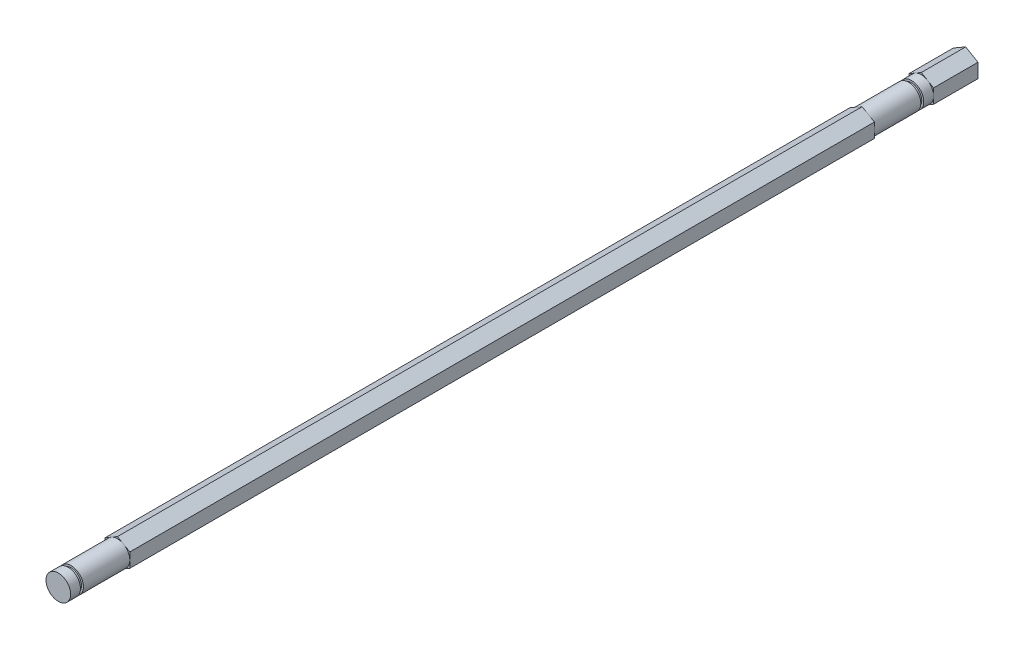
ISO-10303-21;
HEADER;
FILE_DESCRIPTION(('STEP AP214'),'2;1');
FILE_NAME('part.step','',(''),(''),'','','');
FILE_SCHEMA(('AUTOMOTIVE_DESIGN { 1 0 10303 214 1 1 1 1 }'));
ENDSEC;
DATA;
#1=APPLICATION_CONTEXT('core data for automotive mechanical design processes');
#2=APPLICATION_PROTOCOL_DEFINITION('international standard','automotive_design',2000,#1);
#3=PRODUCT_CONTEXT('',#1,'mechanical');
#4=PRODUCT('Part','Part','',(#3));
#5=PRODUCT_RELATED_PRODUCT_CATEGORY('part','',(#4));
#6=PRODUCT_DEFINITION_FORMATION('','',#4);
#7=PRODUCT_DEFINITION_CONTEXT('part definition',#1,'design');
#8=PRODUCT_DEFINITION('design','',#6,#7);
#9=PRODUCT_DEFINITION_SHAPE('','',#8);
#10=(LENGTH_UNIT() NAMED_UNIT(*) SI_UNIT(.MILLI.,.METRE.));
#11=(NAMED_UNIT(*) PLANE_ANGLE_UNIT() SI_UNIT($,.RADIAN.));
#12=(NAMED_UNIT(*) SI_UNIT($,.STERADIAN.) SOLID_ANGLE_UNIT());
#13=UNCERTAINTY_MEASURE_WITH_UNIT(LENGTH_MEASURE(1.E-05),#10,'distance_accuracy_value','');
#14=(GEOMETRIC_REPRESENTATION_CONTEXT(3) GLOBAL_UNCERTAINTY_ASSIGNED_CONTEXT((#13)) GLOBAL_UNIT_ASSIGNED_CONTEXT((#10,
#11,#12)) REPRESENTATION_CONTEXT('',''));
#15=CARTESIAN_POINT('',(0.,0.,0.));
#16=DIRECTION('',(0.,0.,1.));
#17=DIRECTION('',(1.,0.,0.));
#18=AXIS2_PLACEMENT_3D('',#15,#16,#17);
#19=CARTESIAN_POINT('',(0.,0.,95.885));
#20=DIRECTION('',(0.,0.,1.));
#21=DIRECTION('',(1.,0.,0.));
#22=AXIS2_PLACEMENT_3D('',#19,#20,#21);
#23=CYLINDRICAL_SURFACE('',#22,3.17500000000001);
#24=CARTESIAN_POINT('',(0.,0.,95.885));
#25=DIRECTION('',(0.,0.,1.));
#26=DIRECTION('',(1.,0.,0.));
#27=AXIS2_PLACEMENT_3D('',#24,#25,#26);
#28=CIRCLE('',#27,3.17500000000001);
#29=CARTESIAN_POINT('',(3.175,0.,95.885));
#30=VERTEX_POINT('',#29);
#31=CARTESIAN_POINT('',(1.5875,2.7496306570156,95.885));
#32=VERTEX_POINT('',#31);
#33=EDGE_CURVE('E273',#30,#32,#28,.T.);
#34=ORIENTED_EDGE('',*,*,#33,.T.);
#35=CARTESIAN_POINT('',(-1.5875,2.7496306570156,95.885));
#36=VERTEX_POINT('',#35);
#37=EDGE_CURVE('E278',#32,#36,#28,.T.);
#38=ORIENTED_EDGE('',*,*,#37,.T.);
#39=CARTESIAN_POINT('',(-3.17500000000001,0.,95.885));
#40=VERTEX_POINT('',#39);
#41=EDGE_CURVE('E479',#36,#40,#28,.T.);
#42=ORIENTED_EDGE('',*,*,#41,.T.);
#43=CARTESIAN_POINT('',(-1.5875,-2.7496306570156,95.885));
#44=VERTEX_POINT('',#43);
#45=EDGE_CURVE('E487',#40,#44,#28,.T.);
#46=ORIENTED_EDGE('',*,*,#45,.T.);
#47=CARTESIAN_POINT('',(1.5875,-2.7496306570156,95.885));
#48=VERTEX_POINT('',#47);
#49=EDGE_CURVE('E490',#44,#48,#28,.T.);
#50=ORIENTED_EDGE('',*,*,#49,.T.);
#51=EDGE_CURVE('E279',#48,#30,#28,.T.);
#52=ORIENTED_EDGE('',*,*,#51,.T.);
#53=EDGE_LOOP('',(#34,#38,#42,#46,#50,#52));
#54=FACE_BOUND('',#53,.T.);
#55=CARTESIAN_POINT('',(0.,0.,107.823));
#56=DIRECTION('',(0.,0.,1.));
#57=DIRECTION('',(1.,0.,0.));
#58=AXIS2_PLACEMENT_3D('',#55,#56,#57);
#59=CIRCLE('',#58,3.17500000000001);
#60=CARTESIAN_POINT('',(3.17500000000001,0.,107.823));
#61=VERTEX_POINT('',#60);
#62=EDGE_CURVE('E236',#61,#61,#59,.F.);
#63=ORIENTED_EDGE('',*,*,#62,.T.);
#64=EDGE_LOOP('',(#63));
#65=FACE_BOUND('',#64,.T.);
#66=ADVANCED_FACE('F45',(#54,#65),#23,.T.);
#67=CARTESIAN_POINT('',(0.,0.,-95.885));
#68=DIRECTION('',(0.,0.,-1.));
#69=DIRECTION('',(-1.,0.,0.));
#70=AXIS2_PLACEMENT_3D('',#67,#68,#69);
#71=CYLINDRICAL_SURFACE('',#70,3.175);
#72=CARTESIAN_POINT('',(0.,0.,-95.885));
#73=DIRECTION('',(0.,0.,-1.));
#74=DIRECTION('',(-1.,0.,0.));
#75=AXIS2_PLACEMENT_3D('',#72,#73,#74);
#76=CIRCLE('',#75,3.175);
#77=CARTESIAN_POINT('',(-1.5875,2.74963065701559,-95.885));
#78=VERTEX_POINT('',#77);
#79=CARTESIAN_POINT('',(1.5875,2.74963065701559,-95.885));
#80=VERTEX_POINT('',#79);
#81=EDGE_CURVE('E252',#78,#80,#76,.T.);
#82=ORIENTED_EDGE('',*,*,#81,.T.);
#83=CARTESIAN_POINT('',(3.17499999999999,0.,-95.885));
#84=VERTEX_POINT('',#83);
#85=EDGE_CURVE('E71',#80,#84,#76,.T.);
#86=ORIENTED_EDGE('',*,*,#85,.T.);
#87=CARTESIAN_POINT('',(1.5875,-2.74963065701559,-95.885));
#88=VERTEX_POINT('',#87);
#89=EDGE_CURVE('E428',#84,#88,#76,.T.);
#90=ORIENTED_EDGE('',*,*,#89,.T.);
#91=CARTESIAN_POINT('',(-1.5875,-2.74963065701559,-95.885));
#92=VERTEX_POINT('',#91);
#93=EDGE_CURVE('E431',#88,#92,#76,.T.);
#94=ORIENTED_EDGE('',*,*,#93,.T.);
#95=CARTESIAN_POINT('',(-3.175,0.,-95.885));
#96=VERTEX_POINT('',#95);
#97=EDGE_CURVE('E253',#92,#96,#76,.T.);
#98=ORIENTED_EDGE('',*,*,#97,.T.);
#99=EDGE_CURVE('E247',#96,#78,#76,.T.);
#100=ORIENTED_EDGE('',*,*,#99,.T.);
#101=EDGE_LOOP('',(#82,#86,#90,#94,#98,#100));
#102=FACE_BOUND('',#101,.T.);
#103=CARTESIAN_POINT('',(0.,0.,-107.823));
#104=DIRECTION('',(0.,0.,-1.));
#105=DIRECTION('',(-1.,0.,0.));
#106=AXIS2_PLACEMENT_3D('',#103,#104,#105);
#107=CIRCLE('',#106,3.175);
#108=CARTESIAN_POINT('',(-3.175,0.,-107.823));
#109=VERTEX_POINT('',#108);
#110=EDGE_CURVE('E242',#109,#109,#107,.F.);
#111=ORIENTED_EDGE('',*,*,#110,.T.);
#112=EDGE_LOOP('',(#111));
#113=FACE_BOUND('',#112,.T.);
#114=ADVANCED_FACE('F375',(#102,#113),#71,.T.);
#115=CARTESIAN_POINT('',(3.17499999999998,1.83308710467708,111.125));
#116=DIRECTION('',(-0.5,-0.866025403784438,0.));
#117=DIRECTION('',(0.866025403784439,-0.5,0.));
#118=AXIS2_PLACEMENT_3D('',#115,#116,#117);
#119=PLANE('',#118);
#120=DIRECTION('',(0.866025403784439,-0.5,0.));
#121=VECTOR('',#120,1.);
#122=CARTESIAN_POINT('',(3.17499999999998,1.83308710467708,-95.885));
#123=LINE('',#122,#121);
#124=CARTESIAN_POINT('',(0.,3.66617420935413,-95.885));
#125=VERTEX_POINT('',#124);
#126=EDGE_CURVE('E260',#125,#80,#123,.T.);
#127=ORIENTED_EDGE('',*,*,#126,.F.);
#128=DIRECTION('',(0.,0.,-1.));
#129=VECTOR('',#128,1.);
#130=CARTESIAN_POINT('',(0.,3.66617420935413,111.125));
#131=LINE('',#130,#129);
#132=CARTESIAN_POINT('',(0.,3.66617420935413,95.885));
#133=VERTEX_POINT('',#132);
#134=EDGE_CURVE('E319',#133,#125,#131,.T.);
#135=ORIENTED_EDGE('',*,*,#134,.F.);
#136=DIRECTION('',(-0.866025403784439,0.5,0.));
#137=VECTOR('',#136,1.);
#138=CARTESIAN_POINT('',(3.17499999999998,1.83308710467708,95.885));
#139=LINE('',#138,#137);
#140=EDGE_CURVE('E295',#32,#133,#139,.T.);
#141=ORIENTED_EDGE('',*,*,#140,.F.);
#142=CARTESIAN_POINT('',(3.17499999999998,1.83308710467708,95.885));
#143=VERTEX_POINT('',#142);
#144=EDGE_CURVE('E298',#143,#32,#139,.T.);
#145=ORIENTED_EDGE('',*,*,#144,.F.);
#146=DIRECTION('',(0.,0.,-1.));
#147=VECTOR('',#146,1.);
#148=CARTESIAN_POINT('',(3.17499999999998,1.83308710467708,111.125));
#149=LINE('',#148,#147);
#150=CARTESIAN_POINT('',(3.17499999999998,1.83308710467708,-95.885));
#151=VERTEX_POINT('',#150);
#152=EDGE_CURVE('E299',#143,#151,#149,.T.);
#153=ORIENTED_EDGE('',*,*,#152,.T.);
#154=EDGE_CURVE('E256',#80,#151,#123,.T.);
#155=ORIENTED_EDGE('',*,*,#154,.F.);
#156=EDGE_LOOP('',(#127,#135,#141,#145,#153,#155));
#157=FACE_BOUND('',#156,.T.);
#158=ADVANCED_FACE('F47',(#157),#119,.F.);
#159=CARTESIAN_POINT('',(0.,3.66617420935413,111.125));
#160=DIRECTION('',(0.5,-0.866025403784439,0.));
#161=DIRECTION('',(0.866025403784439,0.5,0.));
#162=AXIS2_PLACEMENT_3D('',#159,#160,#161);
#163=PLANE('',#162);
#164=DIRECTION('',(0.866025403784439,0.5,0.));
#165=VECTOR('',#164,1.);
#166=CARTESIAN_POINT('',(0.,3.66617420935413,-95.885));
#167=LINE('',#166,#165);
#168=CARTESIAN_POINT('',(-3.175,1.83308710467706,-95.885));
#169=VERTEX_POINT('',#168);
#170=EDGE_CURVE('E268',#169,#78,#167,.T.);
#171=ORIENTED_EDGE('',*,*,#170,.F.);
#172=DIRECTION('',(0.,0.,-1.));
#173=VECTOR('',#172,1.);
#174=CARTESIAN_POINT('',(-3.175,1.83308710467706,111.125));
#175=LINE('',#174,#173);
#176=CARTESIAN_POINT('',(-3.175,1.83308710467706,95.885));
#177=VERTEX_POINT('',#176);
#178=EDGE_CURVE('E315',#177,#169,#175,.T.);
#179=ORIENTED_EDGE('',*,*,#178,.F.);
#180=DIRECTION('',(-0.866025403784439,-0.5,0.));
#181=VECTOR('',#180,1.);
#182=CARTESIAN_POINT('',(0.,3.66617420935413,95.885));
#183=LINE('',#182,#181);
#184=EDGE_CURVE('E291',#36,#177,#183,.T.);
#185=ORIENTED_EDGE('',*,*,#184,.F.);
#186=EDGE_CURVE('E294',#133,#36,#183,.T.);
#187=ORIENTED_EDGE('',*,*,#186,.F.);
#188=ORIENTED_EDGE('',*,*,#134,.T.);
#189=EDGE_CURVE('E264',#78,#125,#167,.T.);
#190=ORIENTED_EDGE('',*,*,#189,.F.);
#191=EDGE_LOOP('',(#171,#179,#185,#187,#188,#190));
#192=FACE_BOUND('',#191,.T.);
#193=ADVANCED_FACE('F469',(#192),#163,.F.);
#194=CARTESIAN_POINT('',(-3.175,1.83308710467706,111.125));
#195=DIRECTION('',(1.,0.,0.));
#196=DIRECTION('',(0.,0.,-1.));
#197=AXIS2_PLACEMENT_3D('',#194,#195,#196);
#198=PLANE('',#197);
#199=DIRECTION('',(0.,1.,0.));
#200=VECTOR('',#199,1.);
#201=CARTESIAN_POINT('',(-3.175,1.83308710467706,-95.885));
#202=LINE('',#201,#200);
#203=CARTESIAN_POINT('',(-3.175,-1.83308710467707,-95.885));
#204=VERTEX_POINT('',#203);
#205=EDGE_CURVE('E272',#204,#96,#202,.T.);
#206=ORIENTED_EDGE('',*,*,#205,.F.);
#207=DIRECTION('',(0.,0.,-1.));
#208=VECTOR('',#207,1.);
#209=CARTESIAN_POINT('',(-3.175,-1.83308710467707,111.125));
#210=LINE('',#209,#208);
#211=CARTESIAN_POINT('',(-3.175,-1.83308710467707,95.885));
#212=VERTEX_POINT('',#211);
#213=EDGE_CURVE('E311',#212,#204,#210,.T.);
#214=ORIENTED_EDGE('',*,*,#213,.F.);
#215=DIRECTION('',(0.,-1.,0.));
#216=VECTOR('',#215,1.);
#217=CARTESIAN_POINT('',(-3.175,1.83308710467706,95.885));
#218=LINE('',#217,#216);
#219=EDGE_CURVE('E287',#40,#212,#218,.T.);
#220=ORIENTED_EDGE('',*,*,#219,.F.);
#221=EDGE_CURVE('E290',#177,#40,#218,.T.);
#222=ORIENTED_EDGE('',*,*,#221,.F.);
#223=ORIENTED_EDGE('',*,*,#178,.T.);
#224=EDGE_CURVE('E269',#96,#169,#202,.T.);
#225=ORIENTED_EDGE('',*,*,#224,.F.);
#226=EDGE_LOOP('',(#206,#214,#220,#222,#223,#225));
#227=FACE_BOUND('',#226,.T.);
#228=ADVANCED_FACE('F500',(#227),#198,.F.);
#229=CARTESIAN_POINT('',(-3.175,-1.83308710467707,111.125));
#230=DIRECTION('',(0.5,0.866025403784439,0.));
#231=DIRECTION('',(-0.866025403784439,0.5,0.));
#232=AXIS2_PLACEMENT_3D('',#229,#230,#231);
#233=PLANE('',#232);
#234=DIRECTION('',(-0.866025403784439,0.5,0.));
#235=VECTOR('',#234,1.);
#236=CARTESIAN_POINT('',(-3.175,-1.83308710467707,-95.885));
#237=LINE('',#236,#235);
#238=CARTESIAN_POINT('',(0.,-3.66617420935413,-95.885));
#239=VERTEX_POINT('',#238);
#240=EDGE_CURVE('E261',#239,#92,#237,.T.);
#241=ORIENTED_EDGE('',*,*,#240,.F.);
#242=DIRECTION('',(0.,0.,-1.));
#243=VECTOR('',#242,1.);
#244=CARTESIAN_POINT('',(0.,-3.66617420935413,111.125));
#245=LINE('',#244,#243);
#246=CARTESIAN_POINT('',(0.,-3.66617420935413,95.885));
#247=VERTEX_POINT('',#246);
#248=EDGE_CURVE('E307',#247,#239,#245,.T.);
#249=ORIENTED_EDGE('',*,*,#248,.F.);
#250=DIRECTION('',(0.866025403784439,-0.5,0.));
#251=VECTOR('',#250,1.);
#252=CARTESIAN_POINT('',(-3.175,-1.83308710467707,95.885));
#253=LINE('',#252,#251);
#254=EDGE_CURVE('E283',#44,#247,#253,.T.);
#255=ORIENTED_EDGE('',*,*,#254,.F.);
#256=EDGE_CURVE('E286',#212,#44,#253,.T.);
#257=ORIENTED_EDGE('',*,*,#256,.F.);
#258=ORIENTED_EDGE('',*,*,#213,.T.);
#259=EDGE_CURVE('E265',#92,#204,#237,.T.);
#260=ORIENTED_EDGE('',*,*,#259,.F.);
#261=EDGE_LOOP('',(#241,#249,#255,#257,#258,#260));
#262=FACE_BOUND('',#261,.T.);
#263=ADVANCED_FACE('F511',(#262),#233,.F.);
#264=CARTESIAN_POINT('',(0.,-3.66617420935413,111.125));
#265=DIRECTION('',(-0.5,0.866025403784439,0.));
#266=DIRECTION('',(-0.866025403784439,-0.5,0.));
#267=AXIS2_PLACEMENT_3D('',#264,#265,#266);
#268=PLANE('',#267);
#269=DIRECTION('',(-0.866025403784439,-0.5,0.));
#270=VECTOR('',#269,1.);
#271=CARTESIAN_POINT('',(0.,-3.66617420935413,-95.885));
#272=LINE('',#271,#270);
#273=CARTESIAN_POINT('',(3.17499999999999,-1.83308710467707,-95.885));
#274=VERTEX_POINT('',#273);
#275=EDGE_CURVE('E251',#274,#88,#272,.T.);
#276=ORIENTED_EDGE('',*,*,#275,.F.);
#277=DIRECTION('',(0.,0.,-1.));
#278=VECTOR('',#277,1.);
#279=CARTESIAN_POINT('',(3.17499999999999,-1.83308710467707,111.125));
#280=LINE('',#279,#278);
#281=CARTESIAN_POINT('',(3.17499999999999,-1.83308710467707,95.885));
#282=VERTEX_POINT('',#281);
#283=EDGE_CURVE('E303',#282,#274,#280,.T.);
#284=ORIENTED_EDGE('',*,*,#283,.F.);
#285=DIRECTION('',(0.866025403784439,0.5,0.));
#286=VECTOR('',#285,1.);
#287=CARTESIAN_POINT('',(0.,-3.66617420935413,95.885));
#288=LINE('',#287,#286);
#289=EDGE_CURVE('E277',#48,#282,#288,.T.);
#290=ORIENTED_EDGE('',*,*,#289,.F.);
#291=EDGE_CURVE('E282',#247,#48,#288,.T.);
#292=ORIENTED_EDGE('',*,*,#291,.F.);
#293=ORIENTED_EDGE('',*,*,#248,.T.);
#294=EDGE_CURVE('E257',#88,#239,#272,.T.);
#295=ORIENTED_EDGE('',*,*,#294,.F.);
#296=EDGE_LOOP('',(#276,#284,#290,#292,#293,#295));
#297=FACE_BOUND('',#296,.T.);
#298=ADVANCED_FACE('F396',(#297),#268,.F.);
#299=CARTESIAN_POINT('',(3.17499999999999,-1.83308710467707,111.125));
#300=DIRECTION('',(-1.,0.,0.));
#301=DIRECTION('',(0.,-1.,0.));
#302=AXIS2_PLACEMENT_3D('',#299,#300,#301);
#303=PLANE('',#302);
#304=DIRECTION('',(0.,-1.,0.));
#305=VECTOR('',#304,1.);
#306=CARTESIAN_POINT('',(3.17499999999999,-1.83308710467707,-95.885));
#307=LINE('',#306,#305);
#308=EDGE_CURVE('E12',#151,#84,#307,.T.);
#309=ORIENTED_EDGE('',*,*,#308,.F.);
#310=ORIENTED_EDGE('',*,*,#152,.F.);
#311=DIRECTION('',(0.,1.,0.));
#312=VECTOR('',#311,1.);
#313=CARTESIAN_POINT('',(3.17499999999999,-1.83308710467707,95.885));
#314=LINE('',#313,#312);
#315=EDGE_CURVE('E327',#30,#143,#314,.T.);
#316=ORIENTED_EDGE('',*,*,#315,.F.);
#317=EDGE_CURVE('E330',#282,#30,#314,.T.);
#318=ORIENTED_EDGE('',*,*,#317,.F.);
#319=ORIENTED_EDGE('',*,*,#283,.T.);
#320=EDGE_CURVE('E55',#84,#274,#307,.T.);
#321=ORIENTED_EDGE('',*,*,#320,.F.);
#322=EDGE_LOOP('',(#309,#310,#316,#318,#319,#321));
#323=FACE_BOUND('',#322,.T.);
#324=ADVANCED_FACE('F387',(#323),#303,.F.);
#325=CARTESIAN_POINT('',(0.,0.,95.885));
#326=DIRECTION('',(0.,0.,1.));
#327=DIRECTION('',(1.,0.,0.));
#328=AXIS2_PLACEMENT_3D('',#325,#326,#327);
#329=PLANE('',#328);
#330=ORIENTED_EDGE('',*,*,#144,.T.);
#331=ORIENTED_EDGE('',*,*,#33,.F.);
#332=ORIENTED_EDGE('',*,*,#315,.T.);
#333=EDGE_LOOP('',(#330,#331,#332));
#334=FACE_BOUND('',#333,.T.);
#335=ADVANCED_FACE('F384',(#334),#329,.T.);
#336=ORIENTED_EDGE('',*,*,#140,.T.);
#337=ORIENTED_EDGE('',*,*,#186,.T.);
#338=ORIENTED_EDGE('',*,*,#37,.F.);
#339=EDGE_LOOP('',(#336,#337,#338));
#340=FACE_BOUND('',#339,.T.);
#341=ADVANCED_FACE('F386',(#340),#329,.T.);
#342=ORIENTED_EDGE('',*,*,#184,.T.);
#343=ORIENTED_EDGE('',*,*,#221,.T.);
#344=ORIENTED_EDGE('',*,*,#41,.F.);
#345=EDGE_LOOP('',(#342,#343,#344));
#346=FACE_BOUND('',#345,.T.);
#347=ADVANCED_FACE('F394',(#346),#329,.T.);
#348=ORIENTED_EDGE('',*,*,#219,.T.);
#349=ORIENTED_EDGE('',*,*,#256,.T.);
#350=ORIENTED_EDGE('',*,*,#45,.F.);
#351=EDGE_LOOP('',(#348,#349,#350));
#352=FACE_BOUND('',#351,.T.);
#353=ADVANCED_FACE('F408',(#352),#329,.T.);
#354=ORIENTED_EDGE('',*,*,#254,.T.);
#355=ORIENTED_EDGE('',*,*,#291,.T.);
#356=ORIENTED_EDGE('',*,*,#49,.F.);
#357=EDGE_LOOP('',(#354,#355,#356));
#358=FACE_BOUND('',#357,.T.);
#359=ADVANCED_FACE('F399',(#358),#329,.T.);
#360=ORIENTED_EDGE('',*,*,#289,.T.);
#361=ORIENTED_EDGE('',*,*,#317,.T.);
#362=ORIENTED_EDGE('',*,*,#51,.F.);
#363=EDGE_LOOP('',(#360,#361,#362));
#364=FACE_BOUND('',#363,.T.);
#365=ADVANCED_FACE('F389',(#364),#329,.T.);
#366=CARTESIAN_POINT('',(0.,0.,-95.885));
#367=DIRECTION('',(0.,0.,-1.));
#368=DIRECTION('',(-1.,0.,0.));
#369=AXIS2_PLACEMENT_3D('',#366,#367,#368);
#370=PLANE('',#369);
#371=ORIENTED_EDGE('',*,*,#205,.T.);
#372=ORIENTED_EDGE('',*,*,#97,.F.);
#373=ORIENTED_EDGE('',*,*,#259,.T.);
#374=EDGE_LOOP('',(#371,#372,#373));
#375=FACE_BOUND('',#374,.T.);
#376=ADVANCED_FACE('F383',(#375),#370,.T.);
#377=ORIENTED_EDGE('',*,*,#224,.T.);
#378=ORIENTED_EDGE('',*,*,#170,.T.);
#379=ORIENTED_EDGE('',*,*,#99,.F.);
#380=EDGE_LOOP('',(#377,#378,#379));
#381=FACE_BOUND('',#380,.T.);
#382=ADVANCED_FACE('F405',(#381),#370,.T.);
#383=ORIENTED_EDGE('',*,*,#189,.T.);
#384=ORIENTED_EDGE('',*,*,#126,.T.);
#385=ORIENTED_EDGE('',*,*,#81,.F.);
#386=EDGE_LOOP('',(#383,#384,#385));
#387=FACE_BOUND('',#386,.T.);
#388=ADVANCED_FACE('F459',(#387),#370,.T.);
#389=ORIENTED_EDGE('',*,*,#240,.T.);
#390=ORIENTED_EDGE('',*,*,#93,.F.);
#391=ORIENTED_EDGE('',*,*,#294,.T.);
#392=EDGE_LOOP('',(#389,#390,#391));
#393=FACE_BOUND('',#392,.T.);
#394=ADVANCED_FACE('F432',(#393),#370,.T.);
#395=ORIENTED_EDGE('',*,*,#154,.T.);
#396=ORIENTED_EDGE('',*,*,#308,.T.);
#397=ORIENTED_EDGE('',*,*,#85,.F.);
#398=EDGE_LOOP('',(#395,#396,#397));
#399=FACE_BOUND('',#398,.T.);
#400=ADVANCED_FACE('F452',(#399),#370,.T.);
#401=ORIENTED_EDGE('',*,*,#275,.T.);
#402=ORIENTED_EDGE('',*,*,#89,.F.);
#403=ORIENTED_EDGE('',*,*,#320,.T.);
#404=EDGE_LOOP('',(#401,#402,#403));
#405=FACE_BOUND('',#404,.T.);
#406=ADVANCED_FACE('F407',(#405),#370,.T.);
#407=CARTESIAN_POINT('',(0.,0.,-108.585));
#408=DIRECTION('',(0.,0.,-1.));
#409=DIRECTION('',(-1.,0.,0.));
#410=AXIS2_PLACEMENT_3D('',#407,#408,#409);
#411=PLANE('',#410);
#412=CARTESIAN_POINT('',(0.,0.,-108.585));
#413=DIRECTION('',(0.,0.,-1.));
#414=DIRECTION('',(-1.,0.,0.));
#415=AXIS2_PLACEMENT_3D('',#412,#413,#414);
#416=CIRCLE('',#415,3.175);
#417=CARTESIAN_POINT('',(-3.175,0.,-108.585));
#418=VERTEX_POINT('',#417);
#419=EDGE_CURVE('E341',#418,#418,#416,.F.);
#420=ORIENTED_EDGE('',*,*,#419,.T.);
#421=EDGE_LOOP('',(#420));
#422=FACE_BOUND('',#421,.T.);
#423=CARTESIAN_POINT('',(0.,0.,-108.585));
#424=DIRECTION('',(0.,0.,-1.));
#425=DIRECTION('',(-1.,0.,0.));
#426=AXIS2_PLACEMENT_3D('',#423,#424,#425);
#427=CIRCLE('',#426,2.667);
#428=CARTESIAN_POINT('',(2.667,0.,-108.585));
#429=VERTEX_POINT('',#428);
#430=EDGE_CURVE('E238',#429,#429,#427,.T.);
#431=ORIENTED_EDGE('',*,*,#430,.T.);
#432=EDGE_LOOP('',(#431));
#433=FACE_BOUND('',#432,.T.);
#434=ADVANCED_FACE('F458',(#422,#433),#411,.F.);
#435=CARTESIAN_POINT('',(0.,0.,-107.823));
#436=DIRECTION('',(0.,0.,-1.));
#437=DIRECTION('',(-1.,0.,0.));
#438=AXIS2_PLACEMENT_3D('',#435,#436,#437);
#439=PLANE('',#438);
#440=ORIENTED_EDGE('',*,*,#110,.F.);
#441=EDGE_LOOP('',(#440));
#442=FACE_BOUND('',#441,.T.);
#443=CARTESIAN_POINT('',(0.,0.,-107.823));
#444=DIRECTION('',(0.,0.,-1.));
#445=DIRECTION('',(-1.,0.,0.));
#446=AXIS2_PLACEMENT_3D('',#443,#444,#445);
#447=CIRCLE('',#446,2.667);
#448=CARTESIAN_POINT('',(2.667,0.,-107.823));
#449=VERTEX_POINT('',#448);
#450=EDGE_CURVE('E243',#449,#449,#447,.T.);
#451=ORIENTED_EDGE('',*,*,#450,.F.);
#452=EDGE_LOOP('',(#451));
#453=FACE_BOUND('',#452,.T.);
#454=ADVANCED_FACE('F545',(#442,#453),#439,.T.);
#455=CARTESIAN_POINT('',(0.,0.,-108.585));
#456=DIRECTION('',(0.,0.,1.));
#457=DIRECTION('',(1.,0.,0.));
#458=AXIS2_PLACEMENT_3D('',#455,#456,#457);
#459=CYLINDRICAL_SURFACE('',#458,2.667);
#460=CARTESIAN_POINT('',(2.667,0.,-108.585));
#461=CARTESIAN_POINT('',(2.667,0.,-108.5770625));
#462=CARTESIAN_POINT('',(2.667,0.,-108.569125));
#463=CARTESIAN_POINT('',(2.667,0.,-108.55325));
#464=CARTESIAN_POINT('',(2.667,0.,-108.5453125));
#465=CARTESIAN_POINT('',(2.667,0.,-108.5294375));
#466=CARTESIAN_POINT('',(2.667,0.,-108.5215));
#467=CARTESIAN_POINT('',(2.667,0.,-108.505625));
#468=CARTESIAN_POINT('',(2.667,0.,-108.4976875));
#469=CARTESIAN_POINT('',(2.667,0.,-108.4818125));
#470=CARTESIAN_POINT('',(2.667,0.,-108.473875));
#471=CARTESIAN_POINT('',(2.667,0.,-108.458));
#472=CARTESIAN_POINT('',(2.667,0.,-108.4500625));
#473=CARTESIAN_POINT('',(2.667,0.,-108.4341875));
#474=CARTESIAN_POINT('',(2.667,0.,-108.42625));
#475=CARTESIAN_POINT('',(2.667,0.,-108.410375));
#476=CARTESIAN_POINT('',(2.667,0.,-108.4024375));
#477=CARTESIAN_POINT('',(2.667,0.,-108.3865625));
#478=CARTESIAN_POINT('',(2.667,0.,-108.378625));
#479=CARTESIAN_POINT('',(2.667,0.,-108.36275));
#480=CARTESIAN_POINT('',(2.667,0.,-108.3548125));
#481=CARTESIAN_POINT('',(2.667,0.,-108.3389375));
#482=CARTESIAN_POINT('',(2.667,0.,-108.331));
#483=CARTESIAN_POINT('',(2.667,0.,-108.315125));
#484=CARTESIAN_POINT('',(2.667,0.,-108.3071875));
#485=CARTESIAN_POINT('',(2.667,0.,-108.2913125));
#486=CARTESIAN_POINT('',(2.667,0.,-108.283375));
#487=CARTESIAN_POINT('',(2.667,0.,-108.2675));
#488=CARTESIAN_POINT('',(2.667,0.,-108.2595625));
#489=CARTESIAN_POINT('',(2.667,0.,-108.2436875));
#490=CARTESIAN_POINT('',(2.667,0.,-108.23575));
#491=CARTESIAN_POINT('',(2.667,0.,-108.219875));
#492=CARTESIAN_POINT('',(2.667,0.,-108.2119375));
#493=CARTESIAN_POINT('',(2.667,0.,-108.1960625));
#494=CARTESIAN_POINT('',(2.667,0.,-108.188125));
#495=CARTESIAN_POINT('',(2.667,0.,-108.17225));
#496=CARTESIAN_POINT('',(2.667,0.,-108.1643125));
#497=CARTESIAN_POINT('',(2.667,0.,-108.1484375));
#498=CARTESIAN_POINT('',(2.667,0.,-108.1405));
#499=CARTESIAN_POINT('',(2.667,0.,-108.124625));
#500=CARTESIAN_POINT('',(2.667,0.,-108.1166875));
#501=CARTESIAN_POINT('',(2.667,0.,-108.1008125));
#502=CARTESIAN_POINT('',(2.667,0.,-108.092875));
#503=CARTESIAN_POINT('',(2.667,0.,-108.077));
#504=CARTESIAN_POINT('',(2.667,0.,-108.0690625));
#505=CARTESIAN_POINT('',(2.667,0.,-108.0531875));
#506=CARTESIAN_POINT('',(2.667,0.,-108.04525));
#507=CARTESIAN_POINT('',(2.667,0.,-108.029375));
#508=CARTESIAN_POINT('',(2.667,0.,-108.0214375));
#509=CARTESIAN_POINT('',(2.667,0.,-108.0055625));
#510=CARTESIAN_POINT('',(2.667,0.,-107.997625));
#511=CARTESIAN_POINT('',(2.667,0.,-107.98175));
#512=CARTESIAN_POINT('',(2.667,0.,-107.9738125));
#513=CARTESIAN_POINT('',(2.667,0.,-107.9579375));
#514=CARTESIAN_POINT('',(2.667,0.,-107.95));
#515=CARTESIAN_POINT('',(2.667,0.,-107.934125));
#516=CARTESIAN_POINT('',(2.667,0.,-107.9261875));
#517=CARTESIAN_POINT('',(2.667,0.,-107.9103125));
#518=CARTESIAN_POINT('',(2.667,0.,-107.902375));
#519=CARTESIAN_POINT('',(2.667,0.,-107.8865));
#520=CARTESIAN_POINT('',(2.667,0.,-107.8785625));
#521=CARTESIAN_POINT('',(2.667,0.,-107.8626875));
#522=CARTESIAN_POINT('',(2.667,0.,-107.85475));
#523=CARTESIAN_POINT('',(2.667,0.,-107.838875));
#524=CARTESIAN_POINT('',(2.667,0.,-107.8309375));
#525=CARTESIAN_POINT('',(2.667,0.,-107.823));
#526=B_SPLINE_CURVE_WITH_KNOTS('',3,(#460,#461,#462,#463,#464,#465,#466,#467,#468,#469,#470,
#471,#472,#473,#474,#475,#476,#477,#478,#479,#480,#481,#482,#483,#484,#485,#486,#487,#488,#489,
#490,#491,#492,#493,#494,#495,#496,#497,#498,#499,#500,#501,#502,#503,#504,#505,#506,#507,#508,
#509,#510,#511,#512,#513,#514,#515,#516,#517,#518,#519,#520,#521,#522,#523,#524,#525),
.UNSPECIFIED.,.F.,.F.,(4,2,2,2,2,2,2,2,2,2,2,2,2,2,2,2,2,2,2,2,2,2,2,2,2,2,2,2,2,2,2,2,4),(0.,
0.0238124999999978,0.0476249999999956,0.0714374999999934,0.0952499999999912,0.119062499999989,
0.142874999999987,0.166687499999998,0.190499999999996,0.214312499999994,0.238124999999992,
0.26193749999999,0.285749999999987,0.309562499999999,0.333374999999997,0.357187499999995,
0.380999999999992,0.40481249999999,0.428624999999988,0.452437499999986,0.476249999999998,
0.500062499999995,0.523874999999993,0.547687499999991,0.571499999999989,0.595312499999986,
0.619124999999998,0.642937499999996,0.666749999999994,0.690562499999992,0.714374999999989,
0.738187499999987,0.761999999999999),.UNSPECIFIED.);
#527=EDGE_CURVE('BSEAM555',#429,#449,#526,.T.);
#528=ORIENTED_EDGE('',*,*,#430,.F.);
#529=ORIENTED_EDGE('',*,*,#450,.T.);
#530=ORIENTED_EDGE('',*,*,#527,.T.);
#531=ORIENTED_EDGE('',*,*,#527,.F.);
#532=EDGE_LOOP('',(#528,#530,#529,#531));
#533=FACE_BOUND('',#532,.T.);
#534=ADVANCED_FACE('F555',(#533),#459,.T.);
#535=ORIENTED_EDGE('',*,*,#419,.F.);
#536=EDGE_LOOP('',(#535));
#537=FACE_BOUND('',#536,.T.);
#538=CARTESIAN_POINT('',(0.,0.,-111.125));
#539=DIRECTION('',(0.,0.,1.));
#540=DIRECTION('',(1.,0.,0.));
#541=AXIS2_PLACEMENT_3D('',#538,#539,#540);
#542=CIRCLE('',#541,3.175);
#543=CARTESIAN_POINT('',(3.17500005944907,0.,-111.125));
#544=VERTEX_POINT('',#543);
#545=CARTESIAN_POINT('',(1.58750002972454,2.7496307085,-111.125));
#546=VERTEX_POINT('',#545);
#547=EDGE_CURVE('E331',#544,#546,#542,.T.);
#548=ORIENTED_EDGE('',*,*,#547,.T.);
#549=CARTESIAN_POINT('',(-1.58750002972454,2.7496307085,-111.125));
#550=VERTEX_POINT('',#549);
#551=EDGE_CURVE('E334',#546,#550,#542,.T.);
#552=ORIENTED_EDGE('',*,*,#551,.T.);
#553=CARTESIAN_POINT('',(-3.17500005944907,0.,-111.125));
#554=VERTEX_POINT('',#553);
#555=EDGE_CURVE('E758',#550,#554,#542,.T.);
#556=ORIENTED_EDGE('',*,*,#555,.T.);
#557=CARTESIAN_POINT('',(-1.58750002972454,-2.7496307085,-111.125));
#558=VERTEX_POINT('',#557);
#559=EDGE_CURVE('E755',#554,#558,#542,.T.);
#560=ORIENTED_EDGE('',*,*,#559,.T.);
#561=CARTESIAN_POINT('',(1.58750002972453,-2.7496307085,-111.125));
#562=VERTEX_POINT('',#561);
#563=EDGE_CURVE('E738',#558,#562,#542,.T.);
#564=ORIENTED_EDGE('',*,*,#563,.T.);
#565=EDGE_CURVE('E335',#562,#544,#542,.T.);
#566=ORIENTED_EDGE('',*,*,#565,.T.);
#567=EDGE_LOOP('',(#548,#552,#556,#560,#564,#566));
#568=FACE_BOUND('',#567,.T.);
#569=ADVANCED_FACE('F381',(#537,#568),#71,.T.);
#570=CARTESIAN_POINT('',(0.,0.,108.585));
#571=DIRECTION('',(0.,0.,1.));
#572=DIRECTION('',(1.,0.,0.));
#573=AXIS2_PLACEMENT_3D('',#570,#571,#572);
#574=PLANE('',#573);
#575=CARTESIAN_POINT('',(0.,0.,108.585));
#576=DIRECTION('',(0.,0.,1.));
#577=DIRECTION('',(1.,0.,0.));
#578=AXIS2_PLACEMENT_3D('',#575,#576,#577);
#579=CIRCLE('',#578,3.17500000000001);
#580=CARTESIAN_POINT('',(3.17500000000001,0.,108.585));
#581=VERTEX_POINT('',#580);
#582=EDGE_CURVE('E49',#581,#581,#579,.F.);
#583=ORIENTED_EDGE('',*,*,#582,.T.);
#584=EDGE_LOOP('',(#583));
#585=FACE_BOUND('',#584,.T.);
#586=CARTESIAN_POINT('',(0.,0.,108.585));
#587=DIRECTION('',(0.,0.,1.));
#588=DIRECTION('',(1.,0.,0.));
#589=AXIS2_PLACEMENT_3D('',#586,#587,#588);
#590=CIRCLE('',#589,2.667);
#591=CARTESIAN_POINT('',(-2.667,0.,108.585));
#592=VERTEX_POINT('',#591);
#593=EDGE_CURVE('E228',#592,#592,#590,.T.);
#594=ORIENTED_EDGE('',*,*,#593,.T.);
#595=EDGE_LOOP('',(#594));
#596=FACE_BOUND('',#595,.T.);
#597=ADVANCED_FACE('F352',(#585,#596),#574,.F.);
#598=CARTESIAN_POINT('',(0.,0.,107.823));
#599=DIRECTION('',(0.,0.,1.));
#600=DIRECTION('',(1.,0.,0.));
#601=AXIS2_PLACEMENT_3D('',#598,#599,#600);
#602=PLANE('',#601);
#603=ORIENTED_EDGE('',*,*,#62,.F.);
#604=EDGE_LOOP('',(#603));
#605=FACE_BOUND('',#604,.T.);
#606=CARTESIAN_POINT('',(0.,0.,107.823));
#607=DIRECTION('',(0.,0.,1.));
#608=DIRECTION('',(1.,0.,0.));
#609=AXIS2_PLACEMENT_3D('',#606,#607,#608);
#610=CIRCLE('',#609,2.667);
#611=CARTESIAN_POINT('',(-2.667,0.,107.823));
#612=VERTEX_POINT('',#611);
#613=EDGE_CURVE('E223',#612,#612,#610,.T.);
#614=ORIENTED_EDGE('',*,*,#613,.F.);
#615=EDGE_LOOP('',(#614));
#616=FACE_BOUND('',#615,.T.);
#617=ADVANCED_FACE('F369',(#605,#616),#602,.T.);
#618=CARTESIAN_POINT('',(0.,0.,108.585));
#619=DIRECTION('',(0.,0.,-1.));
#620=DIRECTION('',(-1.,0.,0.));
#621=AXIS2_PLACEMENT_3D('',#618,#619,#620);
#622=CYLINDRICAL_SURFACE('',#621,2.667);
#623=CARTESIAN_POINT('',(-2.667,0.,108.585));
#624=CARTESIAN_POINT('',(-2.667,0.,108.5770625));
#625=CARTESIAN_POINT('',(-2.667,0.,108.569125));
#626=CARTESIAN_POINT('',(-2.667,0.,108.55325));
#627=CARTESIAN_POINT('',(-2.667,0.,108.5453125));
#628=CARTESIAN_POINT('',(-2.667,0.,108.5294375));
#629=CARTESIAN_POINT('',(-2.667,0.,108.5215));
#630=CARTESIAN_POINT('',(-2.667,0.,108.505625));
#631=CARTESIAN_POINT('',(-2.667,0.,108.4976875));
#632=CARTESIAN_POINT('',(-2.667,0.,108.4818125));
#633=CARTESIAN_POINT('',(-2.667,0.,108.473875));
#634=CARTESIAN_POINT('',(-2.667,0.,108.458));
#635=CARTESIAN_POINT('',(-2.667,0.,108.4500625));
#636=CARTESIAN_POINT('',(-2.667,0.,108.4341875));
#637=CARTESIAN_POINT('',(-2.667,0.,108.42625));
#638=CARTESIAN_POINT('',(-2.667,0.,108.410375));
#639=CARTESIAN_POINT('',(-2.667,0.,108.4024375));
#640=CARTESIAN_POINT('',(-2.667,0.,108.3865625));
#641=CARTESIAN_POINT('',(-2.667,0.,108.378625));
#642=CARTESIAN_POINT('',(-2.667,0.,108.36275));
#643=CARTESIAN_POINT('',(-2.667,0.,108.3548125));
#644=CARTESIAN_POINT('',(-2.667,0.,108.3389375));
#645=CARTESIAN_POINT('',(-2.667,0.,108.331));
#646=CARTESIAN_POINT('',(-2.667,0.,108.315125));
#647=CARTESIAN_POINT('',(-2.667,0.,108.3071875));
#648=CARTESIAN_POINT('',(-2.667,0.,108.2913125));
#649=CARTESIAN_POINT('',(-2.667,0.,108.283375));
#650=CARTESIAN_POINT('',(-2.667,0.,108.2675));
#651=CARTESIAN_POINT('',(-2.667,0.,108.2595625));
#652=CARTESIAN_POINT('',(-2.667,0.,108.2436875));
#653=CARTESIAN_POINT('',(-2.667,0.,108.23575));
#654=CARTESIAN_POINT('',(-2.667,0.,108.219875));
#655=CARTESIAN_POINT('',(-2.667,0.,108.2119375));
#656=CARTESIAN_POINT('',(-2.667,0.,108.1960625));
#657=CARTESIAN_POINT('',(-2.667,0.,108.188125));
#658=CARTESIAN_POINT('',(-2.667,0.,108.17225));
#659=CARTESIAN_POINT('',(-2.667,0.,108.1643125));
#660=CARTESIAN_POINT('',(-2.667,0.,108.1484375));
#661=CARTESIAN_POINT('',(-2.667,0.,108.1405));
#662=CARTESIAN_POINT('',(-2.667,0.,108.124625));
#663=CARTESIAN_POINT('',(-2.667,0.,108.1166875));
#664=CARTESIAN_POINT('',(-2.667,0.,108.1008125));
#665=CARTESIAN_POINT('',(-2.667,0.,108.092875));
#666=CARTESIAN_POINT('',(-2.667,0.,108.077));
#667=CARTESIAN_POINT('',(-2.667,0.,108.0690625));
#668=CARTESIAN_POINT('',(-2.667,0.,108.0531875));
#669=CARTESIAN_POINT('',(-2.667,0.,108.04525));
#670=CARTESIAN_POINT('',(-2.667,0.,108.029375));
#671=CARTESIAN_POINT('',(-2.667,0.,108.0214375));
#672=CARTESIAN_POINT('',(-2.667,0.,108.0055625));
#673=CARTESIAN_POINT('',(-2.667,0.,107.997625));
#674=CARTESIAN_POINT('',(-2.667,0.,107.98175));
#675=CARTESIAN_POINT('',(-2.667,0.,107.9738125));
#676=CARTESIAN_POINT('',(-2.667,0.,107.9579375));
#677=CARTESIAN_POINT('',(-2.667,0.,107.95));
#678=CARTESIAN_POINT('',(-2.667,0.,107.934125));
#679=CARTESIAN_POINT('',(-2.667,0.,107.9261875));
#680=CARTESIAN_POINT('',(-2.667,0.,107.9103125));
#681=CARTESIAN_POINT('',(-2.667,0.,107.902375));
#682=CARTESIAN_POINT('',(-2.667,0.,107.8865));
#683=CARTESIAN_POINT('',(-2.667,0.,107.8785625));
#684=CARTESIAN_POINT('',(-2.667,0.,107.8626875));
#685=CARTESIAN_POINT('',(-2.667,0.,107.85475));
#686=CARTESIAN_POINT('',(-2.667,0.,107.838875));
#687=CARTESIAN_POINT('',(-2.667,0.,107.8309375));
#688=CARTESIAN_POINT('',(-2.667,0.,107.823));
#689=B_SPLINE_CURVE_WITH_KNOTS('',3,(#623,#624,#625,#626,#627,#628,#629,#630,#631,#632,#633,
#634,#635,#636,#637,#638,#639,#640,#641,#642,#643,#644,#645,#646,#647,#648,#649,#650,#651,#652,
#653,#654,#655,#656,#657,#658,#659,#660,#661,#662,#663,#664,#665,#666,#667,#668,#669,#670,#671,
#672,#673,#674,#675,#676,#677,#678,#679,#680,#681,#682,#683,#684,#685,#686,#687,#688),
.UNSPECIFIED.,.F.,.F.,(4,2,2,2,2,2,2,2,2,2,2,2,2,2,2,2,2,2,2,2,2,2,2,2,2,2,2,2,2,2,2,2,4),(0.,
0.0238124999999978,0.0476249999999956,0.0714374999999934,0.0952499999999912,0.119062499999989,
0.142874999999987,0.166687499999998,0.190499999999996,0.214312499999994,0.238124999999992,
0.26193749999999,0.285749999999987,0.309562499999999,0.333374999999997,0.357187499999995,
0.380999999999992,0.40481249999999,0.428624999999988,0.452437499999986,0.476249999999998,
0.500062499999995,0.523874999999993,0.547687499999991,0.571499999999989,0.595312499999986,
0.619124999999998,0.642937499999996,0.666749999999994,0.690562499999992,0.714374999999989,
0.738187499999987,0.761999999999999),.UNSPECIFIED.);
#690=EDGE_CURVE('BSEAM364',#592,#612,#689,.T.);
#691=ORIENTED_EDGE('',*,*,#593,.F.);
#692=ORIENTED_EDGE('',*,*,#613,.T.);
#693=ORIENTED_EDGE('',*,*,#690,.T.);
#694=ORIENTED_EDGE('',*,*,#690,.F.);
#695=EDGE_LOOP('',(#691,#693,#692,#694));
#696=FACE_BOUND('',#695,.T.);
#697=ADVANCED_FACE('F364',(#696),#622,.T.);
#698=CARTESIAN_POINT('',(0.,0.,111.125));
#699=DIRECTION('',(0.,0.,1.));
#700=DIRECTION('',(1.,0.,0.));
#701=AXIS2_PLACEMENT_3D('',#698,#699,#700);
#702=PLANE('',#701);
#703=CARTESIAN_POINT('',(0.,0.,111.125));
#704=DIRECTION('',(0.,0.,1.));
#705=DIRECTION('',(1.,0.,0.));
#706=AXIS2_PLACEMENT_3D('',#703,#704,#705);
#707=CIRCLE('',#706,3.17500000000001);
#708=CARTESIAN_POINT('',(3.17500000000001,0.,111.125));
#709=VERTEX_POINT('',#708);
#710=EDGE_CURVE('E323',#709,#709,#707,.T.);
#711=ORIENTED_EDGE('',*,*,#710,.T.);
#712=EDGE_LOOP('',(#711));
#713=FACE_BOUND('',#712,.T.);
#714=ADVANCED_FACE('F359',(#713),#702,.T.);
#715=CARTESIAN_POINT('',(3.17500000000001,0.,108.585));
#716=CARTESIAN_POINT('',(3.17500000000001,0.,108.611458333333));
#717=CARTESIAN_POINT('',(3.17500000000001,0.,108.637916666667));
#718=CARTESIAN_POINT('',(3.17500000000001,0.,108.690833333333));
#719=CARTESIAN_POINT('',(3.17500000000001,0.,108.717291666667));
#720=CARTESIAN_POINT('',(3.17500000000001,0.,108.770208333333));
#721=CARTESIAN_POINT('',(3.17500000000001,0.,108.796666666667));
#722=CARTESIAN_POINT('',(3.17500000000001,0.,108.849583333333));
#723=CARTESIAN_POINT('',(3.17500000000001,0.,108.876041666667));
#724=CARTESIAN_POINT('',(3.17500000000001,0.,108.928958333333));
#725=CARTESIAN_POINT('',(3.17500000000001,0.,108.955416666667));
#726=CARTESIAN_POINT('',(3.17500000000001,0.,109.008333333333));
#727=CARTESIAN_POINT('',(3.17500000000001,0.,109.034791666667));
#728=CARTESIAN_POINT('',(3.17500000000001,0.,109.087708333333));
#729=CARTESIAN_POINT('',(3.17500000000001,0.,109.114166666667));
#730=CARTESIAN_POINT('',(3.17500000000001,0.,109.167083333333));
#731=CARTESIAN_POINT('',(3.17500000000001,0.,109.193541666667));
#732=CARTESIAN_POINT('',(3.17500000000001,0.,109.246458333333));
#733=CARTESIAN_POINT('',(3.17500000000001,0.,109.272916666667));
#734=CARTESIAN_POINT('',(3.17500000000001,0.,109.325833333333));
#735=CARTESIAN_POINT('',(3.17500000000001,0.,109.352291666667));
#736=CARTESIAN_POINT('',(3.17500000000001,0.,109.405208333333));
#737=CARTESIAN_POINT('',(3.17500000000001,0.,109.431666666667));
#738=CARTESIAN_POINT('',(3.17500000000001,0.,109.484583333333));
#739=CARTESIAN_POINT('',(3.17500000000001,0.,109.511041666667));
#740=CARTESIAN_POINT('',(3.17500000000001,0.,109.563958333333));
#741=CARTESIAN_POINT('',(3.17500000000001,0.,109.590416666667));
#742=CARTESIAN_POINT('',(3.17500000000001,0.,109.643333333333));
#743=CARTESIAN_POINT('',(3.17500000000001,0.,109.669791666667));
#744=CARTESIAN_POINT('',(3.17500000000001,0.,109.722708333333));
#745=CARTESIAN_POINT('',(3.17500000000001,0.,109.749166666667));
#746=CARTESIAN_POINT('',(3.17500000000001,0.,109.802083333333));
#747=CARTESIAN_POINT('',(3.17500000000001,0.,109.828541666667));
#748=CARTESIAN_POINT('',(3.17500000000001,0.,109.881458333333));
#749=CARTESIAN_POINT('',(3.17500000000001,0.,109.907916666667));
#750=CARTESIAN_POINT('',(3.17500000000001,0.,109.960833333333));
#751=CARTESIAN_POINT('',(3.17500000000001,0.,109.987291666667));
#752=CARTESIAN_POINT('',(3.17500000000001,0.,110.040208333333));
#753=CARTESIAN_POINT('',(3.17500000000001,0.,110.066666666667));
#754=CARTESIAN_POINT('',(3.17500000000001,0.,110.119583333333));
#755=CARTESIAN_POINT('',(3.17500000000001,0.,110.146041666667));
#756=CARTESIAN_POINT('',(3.17500000000001,0.,110.198958333333));
#757=CARTESIAN_POINT('',(3.17500000000001,0.,110.225416666667));
#758=CARTESIAN_POINT('',(3.17500000000001,0.,110.278333333333));
#759=CARTESIAN_POINT('',(3.17500000000001,0.,110.304791666667));
#760=CARTESIAN_POINT('',(3.17500000000001,0.,110.357708333333));
#761=CARTESIAN_POINT('',(3.17500000000001,0.,110.384166666667));
#762=CARTESIAN_POINT('',(3.17500000000001,0.,110.437083333333));
#763=CARTESIAN_POINT('',(3.17500000000001,0.,110.463541666667));
#764=CARTESIAN_POINT('',(3.17500000000001,0.,110.516458333333));
#765=CARTESIAN_POINT('',(3.17500000000001,0.,110.542916666667));
#766=CARTESIAN_POINT('',(3.17500000000001,0.,110.595833333333));
#767=CARTESIAN_POINT('',(3.17500000000001,0.,110.622291666667));
#768=CARTESIAN_POINT('',(3.17500000000001,0.,110.675208333333));
#769=CARTESIAN_POINT('',(3.17500000000001,0.,110.701666666667));
#770=CARTESIAN_POINT('',(3.17500000000001,0.,110.754583333333));
#771=CARTESIAN_POINT('',(3.17500000000001,0.,110.781041666667));
#772=CARTESIAN_POINT('',(3.17500000000001,0.,110.833958333333));
#773=CARTESIAN_POINT('',(3.17500000000001,0.,110.860416666667));
#774=CARTESIAN_POINT('',(3.17500000000001,0.,110.913333333333));
#775=CARTESIAN_POINT('',(3.17500000000001,0.,110.939791666667));
#776=CARTESIAN_POINT('',(3.17500000000001,0.,110.992708333333));
#777=CARTESIAN_POINT('',(3.17500000000001,0.,111.019166666667));
#778=CARTESIAN_POINT('',(3.17500000000001,0.,111.072083333333));
#779=CARTESIAN_POINT('',(3.17500000000001,0.,111.098541666667));
#780=CARTESIAN_POINT('',(3.17500000000001,0.,111.125));
#781=B_SPLINE_CURVE_WITH_KNOTS('',3,(#715,#716,#717,#718,#719,#720,#721,#722,#723,#724,#725,
#726,#727,#728,#729,#730,#731,#732,#733,#734,#735,#736,#737,#738,#739,#740,#741,#742,#743,#744,
#745,#746,#747,#748,#749,#750,#751,#752,#753,#754,#755,#756,#757,#758,#759,#760,#761,#762,#763,
#764,#765,#766,#767,#768,#769,#770,#771,#772,#773,#774,#775,#776,#777,#778,#779,#780),
.UNSPECIFIED.,.F.,.F.,(4,2,2,2,2,2,2,2,2,2,2,2,2,2,2,2,2,2,2,2,2,2,2,2,2,2,2,2,2,2,2,2,4),(0.,
0.0793749999999926,0.158749999999999,0.238124999999992,0.317499999999998,0.396874999999991,
0.476249999999998,0.55562499999999,0.634999999999997,0.714374999999989,0.793749999999996,
0.873124999999988,0.952499999999995,1.03187499999999,1.11124999999999,1.19062499999999,
1.26999999999999,1.349375,1.42874999999999,1.508125,1.58749999999999,1.666875,1.74624999999999,
1.825625,1.90499999999999,1.984375,2.06374999999999,2.143125,2.22249999999999,2.301875,
2.38124999999999,2.46062499999999,2.53999999999999),.UNSPECIFIED.);
#782=EDGE_CURVE('BSEAM355',#581,#709,#781,.T.);
#783=ORIENTED_EDGE('',*,*,#582,.F.);
#784=ORIENTED_EDGE('',*,*,#710,.F.);
#785=ORIENTED_EDGE('',*,*,#782,.T.);
#786=ORIENTED_EDGE('',*,*,#782,.F.);
#787=EDGE_LOOP('',(#783,#785,#784,#786));
#788=FACE_BOUND('',#787,.T.);
#789=ADVANCED_FACE('F355',(#788),#23,.T.);
#790=CARTESIAN_POINT('',(0.,0.,-111.125));
#791=DIRECTION('',(0.,0.,-1.));
#792=DIRECTION('',(-1.,0.,0.));
#793=AXIS2_PLACEMENT_3D('',#790,#791,#792);
#794=PLANE('',#793);
#795=ORIENTED_EDGE('',*,*,#547,.F.);
#796=DIRECTION('',(0.,-1.,0.));
#797=VECTOR('',#796,1.);
#798=CARTESIAN_POINT('',(3.17500005944907,1.833087139,-111.125));
#799=LINE('',#798,#797);
#800=CARTESIAN_POINT('',(3.17500005944907,1.833087139,-111.125));
#801=VERTEX_POINT('',#800);
#802=EDGE_CURVE('E63',#801,#544,#799,.T.);
#803=ORIENTED_EDGE('',*,*,#802,.F.);
#804=DIRECTION('',(0.866025403784439,-0.5,0.));
#805=VECTOR('',#804,1.);
#806=CARTESIAN_POINT('',(0.,3.666174278,-111.125));
#807=LINE('',#806,#805);
#808=EDGE_CURVE('E764',#546,#801,#807,.T.);
#809=ORIENTED_EDGE('',*,*,#808,.F.);
#810=EDGE_LOOP('',(#795,#803,#809));
#811=FACE_BOUND('',#810,.T.);
#812=ADVANCED_FACE('F358',(#811),#794,.F.);
#813=ORIENTED_EDGE('',*,*,#551,.F.);
#814=CARTESIAN_POINT('',(0.,3.666174278,-111.125));
#815=VERTEX_POINT('',#814);
#816=EDGE_CURVE('E763',#815,#546,#807,.T.);
#817=ORIENTED_EDGE('',*,*,#816,.F.);
#818=DIRECTION('',(0.866025403784439,0.5,0.));
#819=VECTOR('',#818,1.);
#820=CARTESIAN_POINT('',(-3.17500005944907,1.833087139,-111.125));
#821=LINE('',#820,#819);
#822=EDGE_CURVE('E220',#550,#815,#821,.T.);
#823=ORIENTED_EDGE('',*,*,#822,.F.);
#824=EDGE_LOOP('',(#813,#817,#823));
#825=FACE_BOUND('',#824,.T.);
#826=ADVANCED_FACE('F616',(#825),#794,.F.);
#827=ORIENTED_EDGE('',*,*,#555,.F.);
#828=CARTESIAN_POINT('',(-3.17500005944907,1.833087139,-111.125));
#829=VERTEX_POINT('',#828);
#830=EDGE_CURVE('E766',#829,#550,#821,.T.);
#831=ORIENTED_EDGE('',*,*,#830,.F.);
#832=DIRECTION('',(0.,1.,0.));
#833=VECTOR('',#832,1.);
#834=CARTESIAN_POINT('',(-3.17500005944907,-1.833087139,-111.125));
#835=LINE('',#834,#833);
#836=EDGE_CURVE('E777',#554,#829,#835,.T.);
#837=ORIENTED_EDGE('',*,*,#836,.F.);
#838=EDGE_LOOP('',(#827,#831,#837));
#839=FACE_BOUND('',#838,.T.);
#840=ADVANCED_FACE('F627',(#839),#794,.F.);
#841=ORIENTED_EDGE('',*,*,#559,.F.);
#842=CARTESIAN_POINT('',(-3.17500005944907,-1.833087139,-111.125));
#843=VERTEX_POINT('',#842);
#844=EDGE_CURVE('E215',#843,#554,#835,.T.);
#845=ORIENTED_EDGE('',*,*,#844,.F.);
#846=DIRECTION('',(-0.866025403784439,0.5,0.));
#847=VECTOR('',#846,1.);
#848=CARTESIAN_POINT('',(0.,-3.666174278,-111.125));
#849=LINE('',#848,#847);
#850=EDGE_CURVE('E752',#558,#843,#849,.T.);
#851=ORIENTED_EDGE('',*,*,#850,.F.);
#852=EDGE_LOOP('',(#841,#845,#851));
#853=FACE_BOUND('',#852,.T.);
#854=ADVANCED_FACE('F636',(#853),#794,.F.);
#855=ORIENTED_EDGE('',*,*,#563,.F.);
#856=CARTESIAN_POINT('',(0.,-3.666174278,-111.125));
#857=VERTEX_POINT('',#856);
#858=EDGE_CURVE('E743',#857,#558,#849,.T.);
#859=ORIENTED_EDGE('',*,*,#858,.F.);
#860=DIRECTION('',(-0.866025403784439,-0.5,0.));
#861=VECTOR('',#860,1.);
#862=CARTESIAN_POINT('',(3.17500005944907,-1.833087139,-111.125));
#863=LINE('',#862,#861);
#864=EDGE_CURVE('E740',#562,#857,#863,.T.);
#865=ORIENTED_EDGE('',*,*,#864,.F.);
#866=EDGE_LOOP('',(#855,#859,#865));
#867=FACE_BOUND('',#866,.T.);
#868=ADVANCED_FACE('F645',(#867),#794,.F.);
#869=CARTESIAN_POINT('',(-3.17500005944907,1.833087139,-122.555));
#870=DIRECTION('',(0.5,-0.866025403784439,0.));
#871=DIRECTION('',(0.866025403784439,0.5,0.));
#872=AXIS2_PLACEMENT_3D('',#869,#870,#871);
#873=PLANE('',#872);
#874=ORIENTED_EDGE('',*,*,#830,.T.);
#875=ORIENTED_EDGE('',*,*,#822,.T.);
#876=DIRECTION('',(0.,0.,1.));
#877=VECTOR('',#876,1.);
#878=CARTESIAN_POINT('',(0.,3.666174278,-122.555));
#879=LINE('',#878,#877);
#880=CARTESIAN_POINT('',(0.,3.666174278,-122.555));
#881=VERTEX_POINT('',#880);
#882=EDGE_CURVE('E199',#881,#815,#879,.T.);
#883=ORIENTED_EDGE('',*,*,#882,.F.);
#884=DIRECTION('',(0.866025403784439,0.5,0.));
#885=VECTOR('',#884,1.);
#886=CARTESIAN_POINT('',(-3.17500005944907,1.833087139,-122.555));
#887=LINE('',#886,#885);
#888=CARTESIAN_POINT('',(-3.17500005944907,1.833087139,-122.555));
#889=VERTEX_POINT('',#888);
#890=EDGE_CURVE('E205',#889,#881,#887,.T.);
#891=ORIENTED_EDGE('',*,*,#890,.F.);
#892=DIRECTION('',(0.,0.,1.));
#893=VECTOR('',#892,1.);
#894=CARTESIAN_POINT('',(-3.17500005944907,1.833087139,-122.555));
#895=LINE('',#894,#893);
#896=EDGE_CURVE('E781',#889,#829,#895,.T.);
#897=ORIENTED_EDGE('',*,*,#896,.T.);
#898=EDGE_LOOP('',(#874,#875,#883,#891,#897));
#899=FACE_BOUND('',#898,.T.);
#900=ADVANCED_FACE('F218',(#899),#873,.F.);
#901=CARTESIAN_POINT('',(0.,3.666174278,-122.555));
#902=DIRECTION('',(-0.5,-0.866025403784439,0.));
#903=DIRECTION('',(0.866025403784439,-0.5,0.));
#904=AXIS2_PLACEMENT_3D('',#901,#902,#903);
#905=PLANE('',#904);
#906=ORIENTED_EDGE('',*,*,#816,.T.);
#907=ORIENTED_EDGE('',*,*,#808,.T.);
#908=DIRECTION('',(0.,0.,1.));
#909=VECTOR('',#908,1.);
#910=CARTESIAN_POINT('',(3.17500005944907,1.833087139,-122.555));
#911=LINE('',#910,#909);
#912=CARTESIAN_POINT('',(3.17500005944907,1.833087139,-122.555));
#913=VERTEX_POINT('',#912);
#914=EDGE_CURVE('E200',#913,#801,#911,.T.);
#915=ORIENTED_EDGE('',*,*,#914,.F.);
#916=DIRECTION('',(0.866025403784439,-0.5,0.));
#917=VECTOR('',#916,1.);
#918=CARTESIAN_POINT('',(0.,3.666174278,-122.555));
#919=LINE('',#918,#917);
#920=EDGE_CURVE('E194',#881,#913,#919,.T.);
#921=ORIENTED_EDGE('',*,*,#920,.F.);
#922=ORIENTED_EDGE('',*,*,#882,.T.);
#923=EDGE_LOOP('',(#906,#907,#915,#921,#922));
#924=FACE_BOUND('',#923,.T.);
#925=ADVANCED_FACE('F197',(#924),#905,.F.);
#926=CARTESIAN_POINT('',(3.17500005944907,1.833087139,-122.555));
#927=DIRECTION('',(-1.,0.,0.));
#928=DIRECTION('',(0.,-1.,0.));
#929=AXIS2_PLACEMENT_3D('',#926,#927,#928);
#930=PLANE('',#929);
#931=ORIENTED_EDGE('',*,*,#802,.T.);
#932=CARTESIAN_POINT('',(3.17500005944907,-1.833087139,-111.125));
#933=VERTEX_POINT('',#932);
#934=EDGE_CURVE('E733',#544,#933,#799,.T.);
#935=ORIENTED_EDGE('',*,*,#934,.T.);
#936=DIRECTION('',(0.,0.,1.));
#937=VECTOR('',#936,1.);
#938=CARTESIAN_POINT('',(3.17500005944907,-1.833087139,-122.555));
#939=LINE('',#938,#937);
#940=CARTESIAN_POINT('',(3.17500005944907,-1.833087139,-122.555));
#941=VERTEX_POINT('',#940);
#942=EDGE_CURVE('E230',#941,#933,#939,.T.);
#943=ORIENTED_EDGE('',*,*,#942,.F.);
#944=DIRECTION('',(0.,-1.,0.));
#945=VECTOR('',#944,1.);
#946=CARTESIAN_POINT('',(3.17500005944907,1.833087139,-122.555));
#947=LINE('',#946,#945);
#948=EDGE_CURVE('E204',#913,#941,#947,.T.);
#949=ORIENTED_EDGE('',*,*,#948,.F.);
#950=ORIENTED_EDGE('',*,*,#914,.T.);
#951=EDGE_LOOP('',(#931,#935,#943,#949,#950));
#952=FACE_BOUND('',#951,.T.);
#953=ADVANCED_FACE('F670',(#952),#930,.F.);
#954=CARTESIAN_POINT('',(3.17500005944907,-1.833087139,-122.555));
#955=DIRECTION('',(-0.5,0.866025403784439,0.));
#956=DIRECTION('',(-0.866025403784439,-0.5,0.));
#957=AXIS2_PLACEMENT_3D('',#954,#955,#956);
#958=PLANE('',#957);
#959=EDGE_CURVE('E732',#933,#562,#863,.T.);
#960=ORIENTED_EDGE('',*,*,#959,.T.);
#961=ORIENTED_EDGE('',*,*,#864,.T.);
#962=DIRECTION('',(0.,0.,1.));
#963=VECTOR('',#962,1.);
#964=CARTESIAN_POINT('',(0.,-3.666174278,-122.555));
#965=LINE('',#964,#963);
#966=CARTESIAN_POINT('',(0.,-3.666174278,-122.555));
#967=VERTEX_POINT('',#966);
#968=EDGE_CURVE('E788',#967,#857,#965,.T.);
#969=ORIENTED_EDGE('',*,*,#968,.F.);
#970=DIRECTION('',(-0.866025403784439,-0.5,0.));
#971=VECTOR('',#970,1.);
#972=CARTESIAN_POINT('',(3.17500005944907,-1.833087139,-122.555));
#973=LINE('',#972,#971);
#974=EDGE_CURVE('E795',#941,#967,#973,.T.);
#975=ORIENTED_EDGE('',*,*,#974,.F.);
#976=ORIENTED_EDGE('',*,*,#942,.T.);
#977=EDGE_LOOP('',(#960,#961,#969,#975,#976));
#978=FACE_BOUND('',#977,.T.);
#979=ADVANCED_FACE('F679',(#978),#958,.F.);
#980=CARTESIAN_POINT('',(0.,-3.666174278,-122.555));
#981=DIRECTION('',(0.5,0.866025403784439,0.));
#982=DIRECTION('',(-0.866025403784439,0.5,0.));
#983=AXIS2_PLACEMENT_3D('',#980,#981,#982);
#984=PLANE('',#983);
#985=ORIENTED_EDGE('',*,*,#858,.T.);
#986=ORIENTED_EDGE('',*,*,#850,.T.);
#987=DIRECTION('',(0.,0.,1.));
#988=VECTOR('',#987,1.);
#989=CARTESIAN_POINT('',(-3.17500005944907,-1.833087139,-122.555));
#990=LINE('',#989,#988);
#991=CARTESIAN_POINT('',(-3.17500005944907,-1.833087139,-122.555));
#992=VERTEX_POINT('',#991);
#993=EDGE_CURVE('E784',#992,#843,#990,.T.);
#994=ORIENTED_EDGE('',*,*,#993,.F.);
#995=DIRECTION('',(-0.866025403784439,0.5,0.));
#996=VECTOR('',#995,1.);
#997=CARTESIAN_POINT('',(0.,-3.666174278,-122.555));
#998=LINE('',#997,#996);
#999=EDGE_CURVE('E793',#967,#992,#998,.T.);
#1000=ORIENTED_EDGE('',*,*,#999,.F.);
#1001=ORIENTED_EDGE('',*,*,#968,.T.);
#1002=EDGE_LOOP('',(#985,#986,#994,#1000,#1001));
#1003=FACE_BOUND('',#1002,.T.);
#1004=ADVANCED_FACE('F688',(#1003),#984,.F.);
#1005=CARTESIAN_POINT('',(-3.17500005944907,-1.833087139,-122.555));
#1006=DIRECTION('',(1.,0.,0.));
#1007=DIRECTION('',(0.,1.,0.));
#1008=AXIS2_PLACEMENT_3D('',#1005,#1006,#1007);
#1009=PLANE('',#1008);
#1010=ORIENTED_EDGE('',*,*,#844,.T.);
#1011=ORIENTED_EDGE('',*,*,#836,.T.);
#1012=ORIENTED_EDGE('',*,*,#896,.F.);
#1013=DIRECTION('',(0.,1.,0.));
#1014=VECTOR('',#1013,1.);
#1015=CARTESIAN_POINT('',(-3.17500005944907,-1.833087139,-122.555));
#1016=LINE('',#1015,#1014);
#1017=EDGE_CURVE('E210',#992,#889,#1016,.T.);
#1018=ORIENTED_EDGE('',*,*,#1017,.F.);
#1019=ORIENTED_EDGE('',*,*,#993,.T.);
#1020=EDGE_LOOP('',(#1010,#1011,#1012,#1018,#1019));
#1021=FACE_BOUND('',#1020,.T.);
#1022=ADVANCED_FACE('F698',(#1021),#1009,.F.);
#1023=CARTESIAN_POINT('',(0.,0.,-122.555));
#1024=DIRECTION('',(0.,0.,-1.));
#1025=DIRECTION('',(-1.,0.,0.));
#1026=AXIS2_PLACEMENT_3D('',#1023,#1024,#1025);
#1027=PLANE('',#1026);
#1028=ORIENTED_EDGE('',*,*,#890,.T.);
#1029=ORIENTED_EDGE('',*,*,#920,.T.);
#1030=ORIENTED_EDGE('',*,*,#948,.T.);
#1031=ORIENTED_EDGE('',*,*,#974,.T.);
#1032=ORIENTED_EDGE('',*,*,#999,.T.);
#1033=ORIENTED_EDGE('',*,*,#1017,.T.);
#1034=EDGE_LOOP('',(#1028,#1029,#1030,#1031,#1032,#1033));
#1035=FACE_BOUND('',#1034,.T.);
#1036=ADVANCED_FACE('F208',(#1035),#1027,.T.);
#1037=ORIENTED_EDGE('',*,*,#565,.F.);
#1038=ORIENTED_EDGE('',*,*,#959,.F.);
#1039=ORIENTED_EDGE('',*,*,#934,.F.);
#1040=EDGE_LOOP('',(#1037,#1038,#1039));
#1041=FACE_BOUND('',#1040,.T.);
#1042=ADVANCED_FACE('F619',(#1041),#794,.F.);
#1043=CLOSED_SHELL('',(#66,#114,#158,#193,#228,#263,#298,#324,#335,#341,#347,#353,#359,#365,
#376,#382,#388,#394,#400,#406,#434,#454,#534,#569,#597,#617,#697,#714,#789,#812,#826,#840,#854,
#868,#900,#925,#953,#979,#1004,#1022,#1036,#1042));
#1044=MANIFOLD_SOLID_BREP('B2',#1043);
#1045=ADVANCED_BREP_SHAPE_REPRESENTATION('',(#18,#1044),#14);
#1046=SHAPE_DEFINITION_REPRESENTATION(#9,#1045);
ENDSEC;
END-ISO-10303-21;
